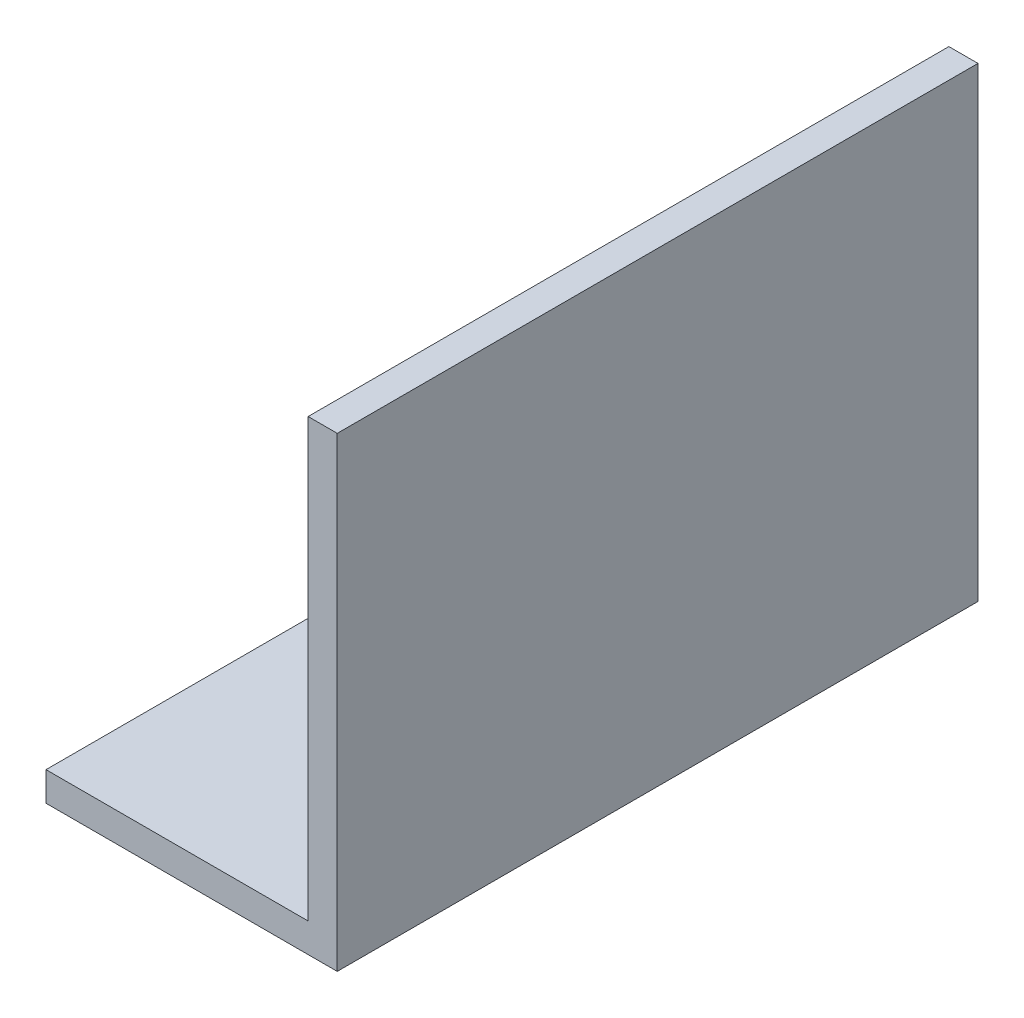
ISO-10303-21;
HEADER;
FILE_DESCRIPTION(('STEP AP214'),'2;1');
FILE_NAME('part.step','',(''),(''),'','','');
FILE_SCHEMA(('AUTOMOTIVE_DESIGN { 1 0 10303 214 1 1 1 1 }'));
ENDSEC;
DATA;
#1=APPLICATION_CONTEXT('core data for automotive mechanical design processes');
#2=APPLICATION_PROTOCOL_DEFINITION('international standard','automotive_design',2000,#1);
#3=PRODUCT_CONTEXT('',#1,'mechanical');
#4=PRODUCT('Part','Part','',(#3));
#5=PRODUCT_RELATED_PRODUCT_CATEGORY('part','',(#4));
#6=PRODUCT_DEFINITION_FORMATION('','',#4);
#7=PRODUCT_DEFINITION_CONTEXT('part definition',#1,'design');
#8=PRODUCT_DEFINITION('design','',#6,#7);
#9=PRODUCT_DEFINITION_SHAPE('','',#8);
#10=(LENGTH_UNIT() NAMED_UNIT(*) SI_UNIT(.MILLI.,.METRE.));
#11=(NAMED_UNIT(*) PLANE_ANGLE_UNIT() SI_UNIT($,.RADIAN.));
#12=(NAMED_UNIT(*) SI_UNIT($,.STERADIAN.) SOLID_ANGLE_UNIT());
#13=UNCERTAINTY_MEASURE_WITH_UNIT(LENGTH_MEASURE(1.E-05),#10,'distance_accuracy_value','');
#14=(GEOMETRIC_REPRESENTATION_CONTEXT(3) GLOBAL_UNCERTAINTY_ASSIGNED_CONTEXT((#13)) GLOBAL_UNIT_ASSIGNED_CONTEXT((#10,
#11,#12)) REPRESENTATION_CONTEXT('',''));
#15=CARTESIAN_POINT('',(0.,0.,0.));
#16=DIRECTION('',(0.,0.,1.));
#17=DIRECTION('',(1.,0.,0.));
#18=AXIS2_PLACEMENT_3D('',#15,#16,#17);
#19=CARTESIAN_POINT('',(-5.,0.,110.));
#20=DIRECTION('',(0.,-1.,0.));
#21=DIRECTION('',(0.,0.,-1.));
#22=AXIS2_PLACEMENT_3D('',#19,#20,#21);
#23=PLANE('',#22);
#24=DIRECTION('',(-1.,0.,0.));
#25=VECTOR('',#24,1.);
#26=CARTESIAN_POINT('',(-5.,0.,0.));
#27=LINE('',#26,#25);
#28=CARTESIAN_POINT('',(0.,0.,0.));
#29=VERTEX_POINT('',#28);
#30=CARTESIAN_POINT('',(-5.,0.,0.));
#31=VERTEX_POINT('',#30);
#32=EDGE_CURVE('E128',#29,#31,#27,.T.);
#33=ORIENTED_EDGE('',*,*,#32,.T.);
#34=DIRECTION('',(0.,0.,-1.));
#35=VECTOR('',#34,1.);
#36=CARTESIAN_POINT('',(-5.,0.,110.));
#37=LINE('',#36,#35);
#38=CARTESIAN_POINT('',(-5.,0.,110.));
#39=VERTEX_POINT('',#38);
#40=EDGE_CURVE('E11',#39,#31,#37,.T.);
#41=ORIENTED_EDGE('',*,*,#40,.F.);
#42=DIRECTION('',(-1.,0.,0.));
#43=VECTOR('',#42,1.);
#44=CARTESIAN_POINT('',(-5.,0.,110.));
#45=LINE('',#44,#43);
#46=CARTESIAN_POINT('',(0.,0.,110.));
#47=VERTEX_POINT('',#46);
#48=EDGE_CURVE('E144',#47,#39,#45,.T.);
#49=ORIENTED_EDGE('',*,*,#48,.F.);
#50=DIRECTION('',(0.,0.,-1.));
#51=VECTOR('',#50,1.);
#52=CARTESIAN_POINT('',(0.,0.,110.));
#53=LINE('',#52,#51);
#54=EDGE_CURVE('E124',#47,#29,#53,.T.);
#55=ORIENTED_EDGE('',*,*,#54,.T.);
#56=EDGE_LOOP('',(#33,#41,#49,#55));
#57=FACE_BOUND('',#56,.T.);
#58=ADVANCED_FACE('F39',(#57),#23,.F.);
#59=CARTESIAN_POINT('',(-5.,-75.,110.));
#60=DIRECTION('',(1.,0.,0.));
#61=DIRECTION('',(0.,0.,-1.));
#62=AXIS2_PLACEMENT_3D('',#59,#60,#61);
#63=PLANE('',#62);
#64=DIRECTION('',(0.,-1.,0.));
#65=VECTOR('',#64,1.);
#66=CARTESIAN_POINT('',(-5.,-75.,0.));
#67=LINE('',#66,#65);
#68=CARTESIAN_POINT('',(-5.,-75.,0.));
#69=VERTEX_POINT('',#68);
#70=EDGE_CURVE('E132',#31,#69,#67,.T.);
#71=ORIENTED_EDGE('',*,*,#70,.T.);
#72=DIRECTION('',(0.,0.,-1.));
#73=VECTOR('',#72,1.);
#74=CARTESIAN_POINT('',(-5.,-75.,110.));
#75=LINE('',#74,#73);
#76=CARTESIAN_POINT('',(-5.,-75.,110.));
#77=VERTEX_POINT('',#76);
#78=EDGE_CURVE('E48',#77,#69,#75,.T.);
#79=ORIENTED_EDGE('',*,*,#78,.F.);
#80=DIRECTION('',(0.,-1.,0.));
#81=VECTOR('',#80,1.);
#82=CARTESIAN_POINT('',(-5.,-75.,110.));
#83=LINE('',#82,#81);
#84=EDGE_CURVE('E93',#39,#77,#83,.T.);
#85=ORIENTED_EDGE('',*,*,#84,.F.);
#86=ORIENTED_EDGE('',*,*,#40,.T.);
#87=EDGE_LOOP('',(#71,#79,#85,#86));
#88=FACE_BOUND('',#87,.T.);
#89=ADVANCED_FACE('F172',(#88),#63,.F.);
#90=CARTESIAN_POINT('',(-50.,-75.,110.));
#91=DIRECTION('',(0.,-1.,0.));
#92=DIRECTION('',(0.,0.,-1.));
#93=AXIS2_PLACEMENT_3D('',#90,#91,#92);
#94=PLANE('',#93);
#95=DIRECTION('',(-1.,0.,0.));
#96=VECTOR('',#95,1.);
#97=CARTESIAN_POINT('',(-50.,-75.,0.));
#98=LINE('',#97,#96);
#99=CARTESIAN_POINT('',(-50.,-75.,0.));
#100=VERTEX_POINT('',#99);
#101=EDGE_CURVE('E135',#69,#100,#98,.T.);
#102=ORIENTED_EDGE('',*,*,#101,.T.);
#103=DIRECTION('',(0.,0.,-1.));
#104=VECTOR('',#103,1.);
#105=CARTESIAN_POINT('',(-50.,-75.,110.));
#106=LINE('',#105,#104);
#107=CARTESIAN_POINT('',(-50.,-75.,110.));
#108=VERTEX_POINT('',#107);
#109=EDGE_CURVE('E117',#108,#100,#106,.T.);
#110=ORIENTED_EDGE('',*,*,#109,.F.);
#111=DIRECTION('',(-1.,0.,0.));
#112=VECTOR('',#111,1.);
#113=CARTESIAN_POINT('',(-50.,-75.,110.));
#114=LINE('',#113,#112);
#115=EDGE_CURVE('E106',#77,#108,#114,.T.);
#116=ORIENTED_EDGE('',*,*,#115,.F.);
#117=ORIENTED_EDGE('',*,*,#78,.T.);
#118=EDGE_LOOP('',(#102,#110,#116,#117));
#119=FACE_BOUND('',#118,.T.);
#120=ADVANCED_FACE('F154',(#119),#94,.F.);
#121=CARTESIAN_POINT('',(-50.,-80.,110.));
#122=DIRECTION('',(1.,0.,0.));
#123=DIRECTION('',(0.,0.,-1.));
#124=AXIS2_PLACEMENT_3D('',#121,#122,#123);
#125=PLANE('',#124);
#126=DIRECTION('',(0.,-1.,0.));
#127=VECTOR('',#126,1.);
#128=CARTESIAN_POINT('',(-50.,-80.,0.));
#129=LINE('',#128,#127);
#130=CARTESIAN_POINT('',(-50.,-80.,0.));
#131=VERTEX_POINT('',#130);
#132=EDGE_CURVE('E115',#100,#131,#129,.T.);
#133=ORIENTED_EDGE('',*,*,#132,.T.);
#134=DIRECTION('',(0.,0.,-1.));
#135=VECTOR('',#134,1.);
#136=CARTESIAN_POINT('',(-50.,-80.,110.));
#137=LINE('',#136,#135);
#138=CARTESIAN_POINT('',(-50.,-80.,110.));
#139=VERTEX_POINT('',#138);
#140=EDGE_CURVE('E112',#139,#131,#137,.T.);
#141=ORIENTED_EDGE('',*,*,#140,.F.);
#142=DIRECTION('',(0.,-1.,0.));
#143=VECTOR('',#142,1.);
#144=CARTESIAN_POINT('',(-50.,-80.,110.));
#145=LINE('',#144,#143);
#146=EDGE_CURVE('E100',#108,#139,#145,.T.);
#147=ORIENTED_EDGE('',*,*,#146,.F.);
#148=ORIENTED_EDGE('',*,*,#109,.T.);
#149=EDGE_LOOP('',(#133,#141,#147,#148));
#150=FACE_BOUND('',#149,.T.);
#151=ADVANCED_FACE('F113',(#150),#125,.F.);
#152=CARTESIAN_POINT('',(0.,-80.,110.));
#153=DIRECTION('',(0.,1.,0.));
#154=DIRECTION('',(0.,0.,1.));
#155=AXIS2_PLACEMENT_3D('',#152,#153,#154);
#156=PLANE('',#155);
#157=DIRECTION('',(1.,0.,0.));
#158=VECTOR('',#157,1.);
#159=CARTESIAN_POINT('',(0.,-80.,0.));
#160=LINE('',#159,#158);
#161=CARTESIAN_POINT('',(0.,-80.,0.));
#162=VERTEX_POINT('',#161);
#163=EDGE_CURVE('E79',#131,#162,#160,.T.);
#164=ORIENTED_EDGE('',*,*,#163,.T.);
#165=DIRECTION('',(0.,0.,-1.));
#166=VECTOR('',#165,1.);
#167=CARTESIAN_POINT('',(0.,-80.,110.));
#168=LINE('',#167,#166);
#169=CARTESIAN_POINT('',(0.,-80.,110.));
#170=VERTEX_POINT('',#169);
#171=EDGE_CURVE('E118',#170,#162,#168,.T.);
#172=ORIENTED_EDGE('',*,*,#171,.F.);
#173=DIRECTION('',(1.,0.,0.));
#174=VECTOR('',#173,1.);
#175=CARTESIAN_POINT('',(0.,-80.,110.));
#176=LINE('',#175,#174);
#177=EDGE_CURVE('E104',#139,#170,#176,.T.);
#178=ORIENTED_EDGE('',*,*,#177,.F.);
#179=ORIENTED_EDGE('',*,*,#140,.T.);
#180=EDGE_LOOP('',(#164,#172,#178,#179));
#181=FACE_BOUND('',#180,.T.);
#182=ADVANCED_FACE('F120',(#181),#156,.F.);
#183=CARTESIAN_POINT('',(0.,0.,110.));
#184=DIRECTION('',(-1.,0.,0.));
#185=DIRECTION('',(0.,-1.,0.));
#186=AXIS2_PLACEMENT_3D('',#183,#184,#185);
#187=PLANE('',#186);
#188=DIRECTION('',(0.,1.,0.));
#189=VECTOR('',#188,1.);
#190=CARTESIAN_POINT('',(0.,0.,0.));
#191=LINE('',#190,#189);
#192=EDGE_CURVE('E85',#162,#29,#191,.T.);
#193=ORIENTED_EDGE('',*,*,#192,.T.);
#194=ORIENTED_EDGE('',*,*,#54,.F.);
#195=DIRECTION('',(0.,1.,0.));
#196=VECTOR('',#195,1.);
#197=CARTESIAN_POINT('',(0.,0.,110.));
#198=LINE('',#197,#196);
#199=EDGE_CURVE('E56',#170,#47,#198,.T.);
#200=ORIENTED_EDGE('',*,*,#199,.F.);
#201=ORIENTED_EDGE('',*,*,#171,.T.);
#202=EDGE_LOOP('',(#193,#194,#200,#201));
#203=FACE_BOUND('',#202,.T.);
#204=ADVANCED_FACE('F161',(#203),#187,.F.);
#205=CARTESIAN_POINT('',(0.,0.,110.));
#206=DIRECTION('',(0.,0.,-1.));
#207=DIRECTION('',(-1.,0.,0.));
#208=AXIS2_PLACEMENT_3D('',#205,#206,#207);
#209=PLANE('',#208);
#210=ORIENTED_EDGE('',*,*,#48,.T.);
#211=ORIENTED_EDGE('',*,*,#84,.T.);
#212=ORIENTED_EDGE('',*,*,#115,.T.);
#213=ORIENTED_EDGE('',*,*,#146,.T.);
#214=ORIENTED_EDGE('',*,*,#177,.T.);
#215=ORIENTED_EDGE('',*,*,#199,.T.);
#216=EDGE_LOOP('',(#210,#211,#212,#213,#214,#215));
#217=FACE_BOUND('',#216,.T.);
#218=ADVANCED_FACE('F102',(#217),#209,.F.);
#219=CARTESIAN_POINT('',(0.,0.,0.));
#220=DIRECTION('',(0.,0.,-1.));
#221=DIRECTION('',(-1.,0.,0.));
#222=AXIS2_PLACEMENT_3D('',#219,#220,#221);
#223=PLANE('',#222);
#224=ORIENTED_EDGE('',*,*,#32,.F.);
#225=ORIENTED_EDGE('',*,*,#192,.F.);
#226=ORIENTED_EDGE('',*,*,#163,.F.);
#227=ORIENTED_EDGE('',*,*,#132,.F.);
#228=ORIENTED_EDGE('',*,*,#101,.F.);
#229=ORIENTED_EDGE('',*,*,#70,.F.);
#230=EDGE_LOOP('',(#224,#225,#226,#227,#228,#229));
#231=FACE_BOUND('',#230,.T.);
#232=ADVANCED_FACE('F157',(#231),#223,.T.);
#233=CLOSED_SHELL('',(#58,#89,#120,#151,#182,#204,#218,#232));
#234=MANIFOLD_SOLID_BREP('B2',#233);
#235=ADVANCED_BREP_SHAPE_REPRESENTATION('',(#18,#234),#14);
#236=SHAPE_DEFINITION_REPRESENTATION(#9,#235);
ENDSEC;
END-ISO-10303-21;
